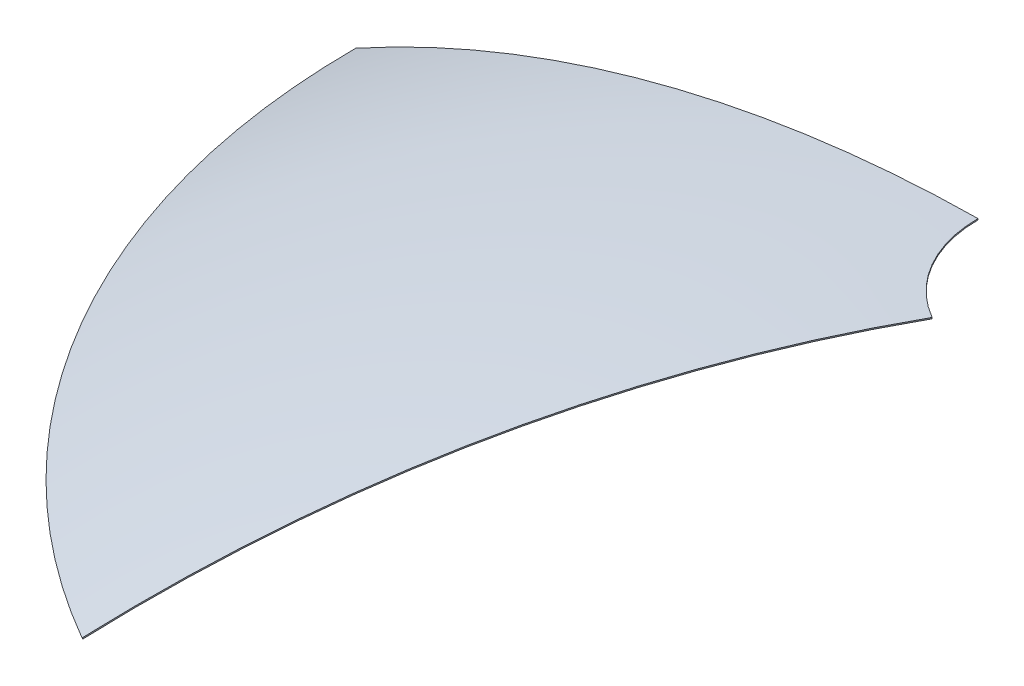
ISO-10303-21;
HEADER;
FILE_DESCRIPTION(('STEP AP214'),'2;1');
FILE_NAME('part.step','',(''),(''),'','','');
FILE_SCHEMA(('AUTOMOTIVE_DESIGN { 1 0 10303 214 1 1 1 1 }'));
ENDSEC;
DATA;
#1=APPLICATION_CONTEXT('core data for automotive mechanical design processes');
#2=APPLICATION_PROTOCOL_DEFINITION('international standard','automotive_design',2000,#1);
#3=PRODUCT_CONTEXT('',#1,'mechanical');
#4=PRODUCT('Part','Part','',(#3));
#5=PRODUCT_RELATED_PRODUCT_CATEGORY('part','',(#4));
#6=PRODUCT_DEFINITION_FORMATION('','',#4);
#7=PRODUCT_DEFINITION_CONTEXT('part definition',#1,'design');
#8=PRODUCT_DEFINITION('design','',#6,#7);
#9=PRODUCT_DEFINITION_SHAPE('','',#8);
#10=(LENGTH_UNIT() NAMED_UNIT(*) SI_UNIT(.MILLI.,.METRE.));
#11=(NAMED_UNIT(*) PLANE_ANGLE_UNIT() SI_UNIT($,.RADIAN.));
#12=(NAMED_UNIT(*) SI_UNIT($,.STERADIAN.) SOLID_ANGLE_UNIT());
#13=UNCERTAINTY_MEASURE_WITH_UNIT(LENGTH_MEASURE(1.E-05),#10,'distance_accuracy_value','');
#14=(GEOMETRIC_REPRESENTATION_CONTEXT(3) GLOBAL_UNCERTAINTY_ASSIGNED_CONTEXT((#13)) GLOBAL_UNIT_ASSIGNED_CONTEXT((#10,
#11,#12)) REPRESENTATION_CONTEXT('',''));
#15=CARTESIAN_POINT('',(0.,0.,0.));
#16=DIRECTION('',(0.,0.,1.));
#17=DIRECTION('',(1.,0.,0.));
#18=AXIS2_PLACEMENT_3D('',#15,#16,#17);
#19=CARTESIAN_POINT('',(1.81799020282369E-12,-527.726621377636,0.));
#20=DIRECTION('',(0.,-1.,0.));
#21=DIRECTION('',(1.,0.,0.));
#22=AXIS2_PLACEMENT_3D('',#19,#20,#21);
#23=DEGENERATE_TOROIDAL_SURFACE('',#22,44.2035089927371,530.163893918988,.T.);
#24=CARTESIAN_POINT('',(0.,2.40279146591038,0.));
#25=DIRECTION('',(0.,-1.,0.));
#26=DIRECTION('',(1.,0.,0.));
#27=AXIS2_PLACEMENT_3D('',#24,#25,#26);
#28=CIRCLE('',#27,50.25);
#29=CARTESIAN_POINT('',(-50.25,2.40279146591005,0.));
#30=VERTEX_POINT('',#29);
#31=CARTESIAN_POINT('',(-25.1249999999994,2.40279146591028,43.5177765401673));
#32=VERTEX_POINT('',#31);
#33=EDGE_CURVE('E81',#30,#32,#28,.F.);
#34=ORIENTED_EDGE('',*,*,#33,.F.);
#35=CARTESIAN_POINT('',(-44.2035089927353,-527.726621377636,0.));
#36=DIRECTION('',(0.,0.,1.));
#37=DIRECTION('',(1.,0.,0.));
#38=AXIS2_PLACEMENT_3D('',#35,#36,#37);
#39=CIRCLE('',#38,530.163893918988);
#40=CARTESIAN_POINT('',(-299.740246695048,-63.2110348793964,0.));
#41=VERTEX_POINT('',#40);
#42=EDGE_CURVE('E90',#30,#41,#39,.T.);
#43=ORIENTED_EDGE('',*,*,#42,.T.);
#44=CARTESIAN_POINT('',(2.21974962611907E-13,-63.2110348793953,0.));
#45=DIRECTION('',(0.,-1.,0.));
#46=DIRECTION('',(1.,0.,0.));
#47=AXIS2_PLACEMENT_3D('',#44,#45,#46);
#48=CIRCLE('',#47,299.740246695048);
#49=CARTESIAN_POINT('',(-149.870123347523,-63.2110348793959,259.582668174526));
#50=VERTEX_POINT('',#49);
#51=EDGE_CURVE('E50',#50,#41,#48,.T.);
#52=ORIENTED_EDGE('',*,*,#51,.F.);
#53=CARTESIAN_POINT('',(-22.1017544963666,-527.726621377636,38.2813617241243));
#54=DIRECTION('',(0.86602540378444,0.,0.499999999999998));
#55=DIRECTION('',(0.499999999999998,0.,-0.86602540378444));
#56=AXIS2_PLACEMENT_3D('',#53,#54,#55);
#57=CIRCLE('',#56,530.163893918988);
#58=EDGE_CURVE('E92',#32,#50,#57,.T.);
#59=ORIENTED_EDGE('',*,*,#58,.F.);
#60=EDGE_LOOP('',(#34,#43,#52,#59));
#61=FACE_BOUND('',#60,.T.);
#62=ADVANCED_FACE('F42',(#61),#23,.T.);
#63=CARTESIAN_POINT('',(1.81799020282369E-12,-527.726621377636,0.));
#64=DIRECTION('',(0.,-1.,0.));
#65=DIRECTION('',(1.,0.,0.));
#66=AXIS2_PLACEMENT_3D('',#63,#64,#65);
#67=DEGENERATE_TOROIDAL_SURFACE('',#66,44.2035089927371,529.663893918988,.T.);
#68=CARTESIAN_POINT('',(0.,1.90275891383207,0.));
#69=DIRECTION('',(0.,-1.,0.));
#70=DIRECTION('',(1.,0.,0.));
#71=AXIS2_PLACEMENT_3D('',#68,#69,#70);
#72=CIRCLE('',#71,50.25);
#73=CARTESIAN_POINT('',(-25.124999999996,1.90275891383197,43.5177765401614));
#74=VERTEX_POINT('',#73);
#75=CARTESIAN_POINT('',(-50.25,1.90275891383174,0.));
#76=VERTEX_POINT('',#75);
#77=EDGE_CURVE('E56',#74,#76,#72,.T.);
#78=ORIENTED_EDGE('',*,*,#77,.F.);
#79=CARTESIAN_POINT('',(-22.1017544963666,-527.726621377636,38.2813617241243));
#80=DIRECTION('',(-0.86602540378444,0.,-0.499999999999998));
#81=DIRECTION('',(0.499999999999998,0.,-0.86602540378444));
#82=AXIS2_PLACEMENT_3D('',#79,#80,#81);
#83=CIRCLE('',#82,529.663893918988);
#84=CARTESIAN_POINT('',(-149.749624412838,-63.6491216595651,259.373957897394));
#85=VERTEX_POINT('',#84);
#86=EDGE_CURVE('E63',#85,#74,#83,.T.);
#87=ORIENTED_EDGE('',*,*,#86,.F.);
#88=CARTESIAN_POINT('',(2.23477709351008E-13,-63.6491216595646,0.));
#89=DIRECTION('',(0.,-1.,0.));
#90=DIRECTION('',(1.,0.,0.));
#91=AXIS2_PLACEMENT_3D('',#88,#89,#90);
#92=CIRCLE('',#91,299.499248825678);
#93=CARTESIAN_POINT('',(-299.499248825678,-63.6491216595657,0.));
#94=VERTEX_POINT('',#93);
#95=EDGE_CURVE('E118',#85,#94,#92,.T.);
#96=ORIENTED_EDGE('',*,*,#95,.T.);
#97=CARTESIAN_POINT('',(-44.2035089927353,-527.726621377636,0.));
#98=DIRECTION('',(0.,0.,-1.));
#99=DIRECTION('',(1.,0.,0.));
#100=AXIS2_PLACEMENT_3D('',#97,#98,#99);
#101=CIRCLE('',#100,529.663893918988);
#102=EDGE_CURVE('E104',#94,#76,#101,.T.);
#103=ORIENTED_EDGE('',*,*,#102,.T.);
#104=EDGE_LOOP('',(#78,#87,#96,#103));
#105=FACE_BOUND('',#104,.T.);
#106=ADVANCED_FACE('F126',(#105),#67,.F.);
#107=CARTESIAN_POINT('',(-22.1017544963666,-527.726621377636,38.2813617241243));
#108=DIRECTION('',(0.86602540378444,0.,0.499999999999998));
#109=DIRECTION('',(0.499999999999998,0.,-0.86602540378444));
#110=AXIS2_PLACEMENT_3D('',#107,#108,#109);
#111=PLANE('',#110);
#112=ORIENTED_EDGE('',*,*,#86,.T.);
#113=DIRECTION('',(0.,-1.,0.));
#114=VECTOR('',#113,1.);
#115=CARTESIAN_POINT('',(-25.1249999999999,10.,43.5177765401681));
#116=LINE('',#115,#114);
#117=EDGE_CURVE('E94',#74,#32,#116,.F.);
#118=ORIENTED_EDGE('',*,*,#117,.T.);
#119=ORIENTED_EDGE('',*,*,#58,.T.);
#120=DIRECTION('',(0.240997869369592,-0.876173560339086,-0.417420554263978));
#121=VECTOR('',#120,1.);
#122=CARTESIAN_POINT('',(-149.870123347523,-63.2110348793959,259.582668174526));
#123=LINE('',#122,#121);
#124=EDGE_CURVE('E114',#50,#85,#123,.T.);
#125=ORIENTED_EDGE('',*,*,#124,.T.);
#126=EDGE_LOOP('',(#112,#118,#119,#125));
#127=FACE_BOUND('',#126,.T.);
#128=ADVANCED_FACE('F125',(#127),#111,.T.);
#129=CARTESIAN_POINT('',(-44.2035089927353,-527.726621377636,0.));
#130=DIRECTION('',(0.,0.,1.));
#131=DIRECTION('',(1.,0.,0.));
#132=AXIS2_PLACEMENT_3D('',#129,#130,#131);
#133=PLANE('',#132);
#134=DIRECTION('',(0.,-1.,0.));
#135=VECTOR('',#134,1.);
#136=CARTESIAN_POINT('',(-50.25,10.,0.));
#137=LINE('',#136,#135);
#138=EDGE_CURVE('E11',#76,#30,#137,.F.);
#139=ORIENTED_EDGE('',*,*,#138,.F.);
#140=ORIENTED_EDGE('',*,*,#102,.F.);
#141=DIRECTION('',(0.481995738739184,-0.876173560339085,0.));
#142=VECTOR('',#141,1.);
#143=CARTESIAN_POINT('',(-299.740246695048,-63.2110348793964,0.));
#144=LINE('',#143,#142);
#145=EDGE_CURVE('E99',#41,#94,#144,.T.);
#146=ORIENTED_EDGE('',*,*,#145,.F.);
#147=ORIENTED_EDGE('',*,*,#42,.F.);
#148=EDGE_LOOP('',(#139,#140,#146,#147));
#149=FACE_BOUND('',#148,.T.);
#150=ADVANCED_FACE('F97',(#149),#133,.F.);
#151=CARTESIAN_POINT('',(2.21974962611907E-13,-63.2110348793953,0.));
#152=DIRECTION('',(0.,1.,0.));
#153=DIRECTION('',(-1.,0.,0.));
#154=AXIS2_PLACEMENT_3D('',#151,#152,#153);
#155=CONICAL_SURFACE('',#154,299.740246695048,0.50293107834379);
#156=ORIENTED_EDGE('',*,*,#95,.F.);
#157=ORIENTED_EDGE('',*,*,#124,.F.);
#158=ORIENTED_EDGE('',*,*,#51,.T.);
#159=ORIENTED_EDGE('',*,*,#145,.T.);
#160=EDGE_LOOP('',(#156,#157,#158,#159));
#161=FACE_BOUND('',#160,.T.);
#162=ADVANCED_FACE('F123',(#161),#155,.T.);
#163=CARTESIAN_POINT('',(0.,10.,0.));
#164=DIRECTION('',(0.,-1.,0.));
#165=DIRECTION('',(0.,0.,-1.));
#166=AXIS2_PLACEMENT_3D('',#163,#164,#165);
#167=CYLINDRICAL_SURFACE('',#166,50.25);
#168=ORIENTED_EDGE('',*,*,#77,.T.);
#169=ORIENTED_EDGE('',*,*,#138,.T.);
#170=ORIENTED_EDGE('',*,*,#33,.T.);
#171=ORIENTED_EDGE('',*,*,#117,.F.);
#172=EDGE_LOOP('',(#168,#169,#170,#171));
#173=FACE_BOUND('',#172,.T.);
#174=ADVANCED_FACE('F80',(#173),#167,.F.);
#175=CLOSED_SHELL('',(#62,#106,#128,#150,#162,#174));
#176=MANIFOLD_SOLID_BREP('B2',#175);
#177=ADVANCED_BREP_SHAPE_REPRESENTATION('',(#18,#176),#14);
#178=SHAPE_DEFINITION_REPRESENTATION(#9,#177);
ENDSEC;
END-ISO-10303-21;
